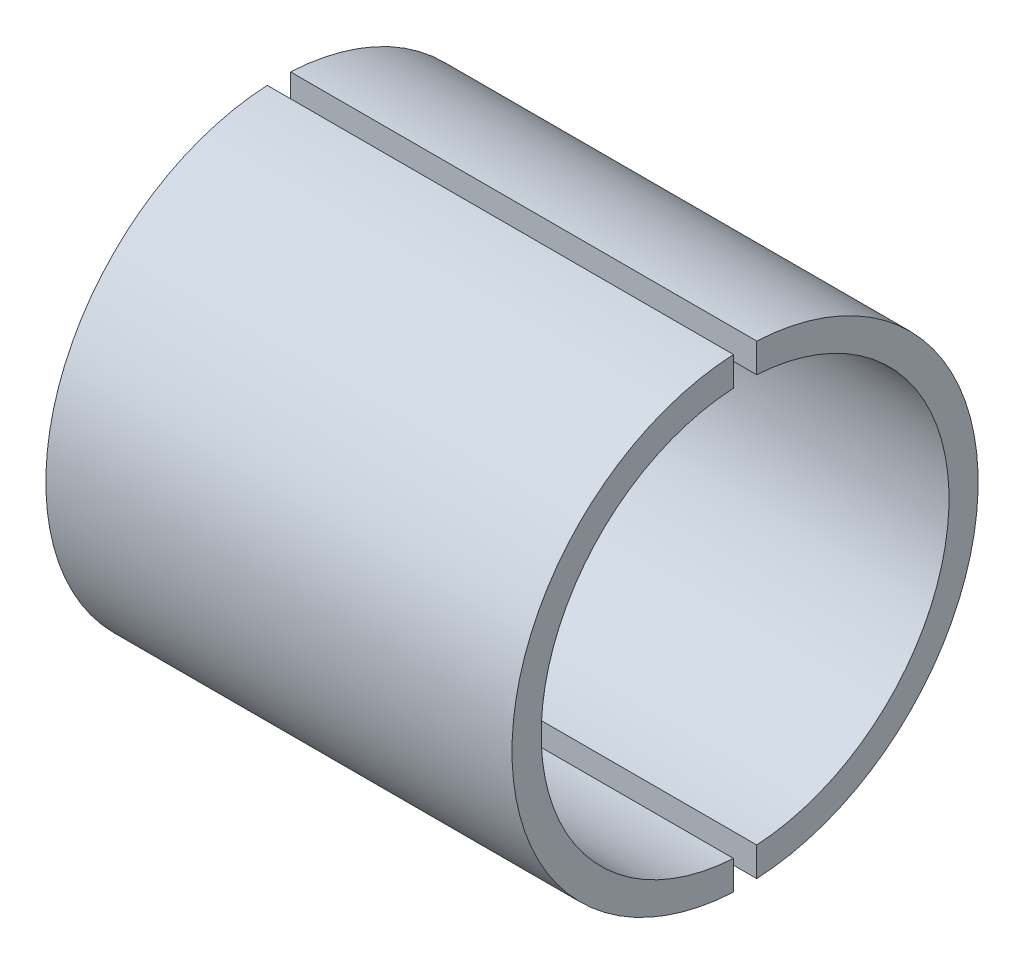
ISO-10303-21;
HEADER;
FILE_DESCRIPTION(('STEP AP214'),'2;1');
FILE_NAME('part.step','',(''),(''),'','','');
FILE_SCHEMA(('AUTOMOTIVE_DESIGN { 1 0 10303 214 1 1 1 1 }'));
ENDSEC;
DATA;
#1=APPLICATION_CONTEXT('core data for automotive mechanical design processes');
#2=APPLICATION_PROTOCOL_DEFINITION('international standard','automotive_design',2000,#1);
#3=PRODUCT_CONTEXT('',#1,'mechanical');
#4=PRODUCT('Part','Part','',(#3));
#5=PRODUCT_RELATED_PRODUCT_CATEGORY('part','',(#4));
#6=PRODUCT_DEFINITION_FORMATION('','',#4);
#7=PRODUCT_DEFINITION_CONTEXT('part definition',#1,'design');
#8=PRODUCT_DEFINITION('design','',#6,#7);
#9=PRODUCT_DEFINITION_SHAPE('','',#8);
#10=(LENGTH_UNIT() NAMED_UNIT(*) SI_UNIT(.MILLI.,.METRE.));
#11=(NAMED_UNIT(*) PLANE_ANGLE_UNIT() SI_UNIT($,.RADIAN.));
#12=(NAMED_UNIT(*) SI_UNIT($,.STERADIAN.) SOLID_ANGLE_UNIT());
#13=UNCERTAINTY_MEASURE_WITH_UNIT(LENGTH_MEASURE(1.E-05),#10,'distance_accuracy_value','');
#14=(GEOMETRIC_REPRESENTATION_CONTEXT(3) GLOBAL_UNCERTAINTY_ASSIGNED_CONTEXT((#13)) GLOBAL_UNIT_ASSIGNED_CONTEXT((#10,
#11,#12)) REPRESENTATION_CONTEXT('',''));
#15=CARTESIAN_POINT('',(0.,0.,0.));
#16=DIRECTION('',(0.,0.,1.));
#17=DIRECTION('',(1.,0.,0.));
#18=AXIS2_PLACEMENT_3D('',#15,#16,#17);
#19=CARTESIAN_POINT('',(40.,0.,0.));
#20=DIRECTION('',(-1.,0.,0.));
#21=DIRECTION('',(0.,0.,1.));
#22=AXIS2_PLACEMENT_3D('',#19,#20,#21);
#23=CYLINDRICAL_SURFACE('',#22,20.);
#24=CARTESIAN_POINT('',(40.,0.,0.));
#25=DIRECTION('',(1.,0.,0.));
#26=DIRECTION('',(0.,0.,-1.));
#27=AXIS2_PLACEMENT_3D('',#24,#25,#26);
#28=CIRCLE('',#27,20.);
#29=CARTESIAN_POINT('',(40.,19.9749843554382,1.));
#30=VERTEX_POINT('',#29);
#31=CARTESIAN_POINT('',(40.,-19.9749843554382,0.999999999999995));
#32=VERTEX_POINT('',#31);
#33=EDGE_CURVE('E107',#30,#32,#28,.T.);
#34=ORIENTED_EDGE('',*,*,#33,.F.);
#35=DIRECTION('',(-1.,0.,0.));
#36=VECTOR('',#35,1.);
#37=CARTESIAN_POINT('',(40.,19.9749843554382,1.));
#38=LINE('',#37,#36);
#39=CARTESIAN_POINT('',(0.,19.9749843554382,1.));
#40=VERTEX_POINT('',#39);
#41=EDGE_CURVE('E91',#30,#40,#38,.T.);
#42=ORIENTED_EDGE('',*,*,#41,.T.);
#43=CARTESIAN_POINT('',(0.,0.,0.));
#44=DIRECTION('',(1.,0.,0.));
#45=DIRECTION('',(0.,0.,-1.));
#46=AXIS2_PLACEMENT_3D('',#43,#44,#45);
#47=CIRCLE('',#46,20.);
#48=CARTESIAN_POINT('',(0.,-19.9749843554382,0.999999999999995));
#49=VERTEX_POINT('',#48);
#50=EDGE_CURVE('E101',#40,#49,#47,.T.);
#51=ORIENTED_EDGE('',*,*,#50,.T.);
#52=DIRECTION('',(-1.,0.,0.));
#53=VECTOR('',#52,1.);
#54=CARTESIAN_POINT('',(40.,-19.9749843554382,0.999999999999995));
#55=LINE('',#54,#53);
#56=EDGE_CURVE('E68',#49,#32,#55,.F.);
#57=ORIENTED_EDGE('',*,*,#56,.T.);
#58=EDGE_LOOP('',(#34,#42,#51,#57));
#59=FACE_BOUND('',#58,.T.);
#60=ADVANCED_FACE('F51',(#59),#23,.T.);
#61=CARTESIAN_POINT('',(40.,0.,0.));
#62=DIRECTION('',(1.,0.,0.));
#63=DIRECTION('',(0.,0.,-1.));
#64=AXIS2_PLACEMENT_3D('',#61,#62,#63);
#65=PLANE('',#64);
#66=DIRECTION('',(0.,-1.,0.));
#67=VECTOR('',#66,1.);
#68=CARTESIAN_POINT('',(40.,21.4786552684882,1.));
#69=LINE('',#68,#67);
#70=CARTESIAN_POINT('',(40.,17.4714052096562,1.));
#71=VERTEX_POINT('',#70);
#72=EDGE_CURVE('E60',#30,#71,#69,.T.);
#73=ORIENTED_EDGE('',*,*,#72,.F.);
#74=ORIENTED_EDGE('',*,*,#33,.T.);
#75=CARTESIAN_POINT('',(40.,-17.4714052096562,0.999999999999995));
#76=VERTEX_POINT('',#75);
#77=EDGE_CURVE('E12',#76,#32,#69,.T.);
#78=ORIENTED_EDGE('',*,*,#77,.F.);
#79=CARTESIAN_POINT('',(40.,0.,0.));
#80=DIRECTION('',(1.,0.,0.));
#81=DIRECTION('',(0.,0.,-1.));
#82=AXIS2_PLACEMENT_3D('',#79,#80,#81);
#83=CIRCLE('',#82,17.5);
#84=EDGE_CURVE('E54',#71,#76,#83,.T.);
#85=ORIENTED_EDGE('',*,*,#84,.F.);
#86=EDGE_LOOP('',(#73,#74,#78,#85));
#87=FACE_BOUND('',#86,.T.);
#88=ADVANCED_FACE('F106',(#87),#65,.T.);
#89=CARTESIAN_POINT('',(0.,0.,0.));
#90=DIRECTION('',(1.,0.,0.));
#91=DIRECTION('',(0.,0.,-1.));
#92=AXIS2_PLACEMENT_3D('',#89,#90,#91);
#93=PLANE('',#92);
#94=ORIENTED_EDGE('',*,*,#50,.F.);
#95=DIRECTION('',(0.,-1.,0.));
#96=VECTOR('',#95,1.);
#97=CARTESIAN_POINT('',(0.,21.4786552684882,1.));
#98=LINE('',#97,#96);
#99=CARTESIAN_POINT('',(0.,17.4714052096562,1.));
#100=VERTEX_POINT('',#99);
#101=EDGE_CURVE('E96',#40,#100,#98,.T.);
#102=ORIENTED_EDGE('',*,*,#101,.T.);
#103=CARTESIAN_POINT('',(0.,0.,0.));
#104=DIRECTION('',(1.,0.,0.));
#105=DIRECTION('',(0.,0.,-1.));
#106=AXIS2_PLACEMENT_3D('',#103,#104,#105);
#107=CIRCLE('',#106,17.5);
#108=CARTESIAN_POINT('',(0.,-17.4714052096562,0.999999999999995));
#109=VERTEX_POINT('',#108);
#110=EDGE_CURVE('E111',#100,#109,#107,.T.);
#111=ORIENTED_EDGE('',*,*,#110,.T.);
#112=EDGE_CURVE('E86',#109,#49,#98,.T.);
#113=ORIENTED_EDGE('',*,*,#112,.T.);
#114=EDGE_LOOP('',(#94,#102,#111,#113));
#115=FACE_BOUND('',#114,.T.);
#116=ADVANCED_FACE('F122',(#115),#93,.F.);
#117=CARTESIAN_POINT('',(0.,0.,0.));
#118=DIRECTION('',(1.,0.,0.));
#119=DIRECTION('',(0.,0.,-1.));
#120=AXIS2_PLACEMENT_3D('',#117,#118,#119);
#121=CYLINDRICAL_SURFACE('',#120,17.5);
#122=ORIENTED_EDGE('',*,*,#84,.T.);
#123=DIRECTION('',(1.,0.,0.));
#124=VECTOR('',#123,1.);
#125=CARTESIAN_POINT('',(0.,-17.4714052096562,0.999999999999995));
#126=LINE('',#125,#124);
#127=EDGE_CURVE('E84',#76,#109,#126,.F.);
#128=ORIENTED_EDGE('',*,*,#127,.T.);
#129=ORIENTED_EDGE('',*,*,#110,.F.);
#130=DIRECTION('',(1.,0.,0.));
#131=VECTOR('',#130,1.);
#132=CARTESIAN_POINT('',(0.,17.4714052096562,1.));
#133=LINE('',#132,#131);
#134=EDGE_CURVE('E109',#100,#71,#133,.T.);
#135=ORIENTED_EDGE('',*,*,#134,.T.);
#136=EDGE_LOOP('',(#122,#128,#129,#135));
#137=FACE_BOUND('',#136,.T.);
#138=ADVANCED_FACE('F121',(#137),#121,.F.);
#139=CARTESIAN_POINT('',(0.,21.4786552684882,1.));
#140=DIRECTION('',(0.,0.,1.));
#141=DIRECTION('',(0.,-1.,0.));
#142=AXIS2_PLACEMENT_3D('',#139,#140,#141);
#143=PLANE('',#142);
#144=ORIENTED_EDGE('',*,*,#72,.T.);
#145=ORIENTED_EDGE('',*,*,#134,.F.);
#146=ORIENTED_EDGE('',*,*,#101,.F.);
#147=ORIENTED_EDGE('',*,*,#41,.F.);
#148=EDGE_LOOP('',(#144,#145,#146,#147));
#149=FACE_BOUND('',#148,.T.);
#150=ADVANCED_FACE('F93',(#149),#143,.F.);
#151=ORIENTED_EDGE('',*,*,#112,.F.);
#152=ORIENTED_EDGE('',*,*,#127,.F.);
#153=ORIENTED_EDGE('',*,*,#77,.T.);
#154=ORIENTED_EDGE('',*,*,#56,.F.);
#155=EDGE_LOOP('',(#151,#152,#153,#154));
#156=FACE_BOUND('',#155,.T.);
#157=ADVANCED_FACE('F156',(#156),#143,.F.);
#158=CLOSED_SHELL('',(#60,#88,#116,#138,#150,#157));
#159=MANIFOLD_SOLID_BREP('B2',#158);
#160=CARTESIAN_POINT('',(0.,0.,0.));
#161=DIRECTION('',(1.,0.,0.));
#162=DIRECTION('',(0.,0.,-1.));
#163=AXIS2_PLACEMENT_3D('',#160,#161,#162);
#164=CYLINDRICAL_SURFACE('',#163,17.5);
#165=CARTESIAN_POINT('',(40.,0.,0.));
#166=DIRECTION('',(1.,0.,0.));
#167=DIRECTION('',(0.,0.,-1.));
#168=AXIS2_PLACEMENT_3D('',#165,#166,#167);
#169=CIRCLE('',#168,17.5);
#170=CARTESIAN_POINT('',(40.,-17.4714052096562,-1.));
#171=VERTEX_POINT('',#170);
#172=CARTESIAN_POINT('',(40.,17.4714052096562,-1.));
#173=VERTEX_POINT('',#172);
#174=EDGE_CURVE('E220',#171,#173,#169,.T.);
#175=ORIENTED_EDGE('',*,*,#174,.T.);
#176=DIRECTION('',(1.,0.,0.));
#177=VECTOR('',#176,1.);
#178=CARTESIAN_POINT('',(0.,17.4714052096562,-1.));
#179=LINE('',#178,#177);
#180=CARTESIAN_POINT('',(0.,17.4714052096562,-1.));
#181=VERTEX_POINT('',#180);
#182=EDGE_CURVE('E49',#173,#181,#179,.F.);
#183=ORIENTED_EDGE('',*,*,#182,.T.);
#184=CARTESIAN_POINT('',(0.,0.,0.));
#185=DIRECTION('',(1.,0.,0.));
#186=DIRECTION('',(0.,0.,-1.));
#187=AXIS2_PLACEMENT_3D('',#184,#185,#186);
#188=CIRCLE('',#187,17.5);
#189=CARTESIAN_POINT('',(0.,-17.4714052096562,-1.));
#190=VERTEX_POINT('',#189);
#191=EDGE_CURVE('E235',#190,#181,#188,.T.);
#192=ORIENTED_EDGE('',*,*,#191,.F.);
#193=DIRECTION('',(1.,0.,0.));
#194=VECTOR('',#193,1.);
#195=CARTESIAN_POINT('',(0.,-17.4714052096562,-1.));
#196=LINE('',#195,#194);
#197=EDGE_CURVE('E182',#190,#171,#196,.T.);
#198=ORIENTED_EDGE('',*,*,#197,.T.);
#199=EDGE_LOOP('',(#175,#183,#192,#198));
#200=FACE_BOUND('',#199,.T.);
#201=ADVANCED_FACE('F174',(#200),#164,.F.);
#202=CARTESIAN_POINT('',(0.,0.,0.));
#203=DIRECTION('',(1.,0.,0.));
#204=DIRECTION('',(0.,0.,-1.));
#205=AXIS2_PLACEMENT_3D('',#202,#203,#204);
#206=PLANE('',#205);
#207=CARTESIAN_POINT('',(0.,0.,0.));
#208=DIRECTION('',(1.,0.,0.));
#209=DIRECTION('',(0.,0.,-1.));
#210=AXIS2_PLACEMENT_3D('',#207,#208,#209);
#211=CIRCLE('',#210,20.);
#212=CARTESIAN_POINT('',(0.,-19.9749843554382,-1.));
#213=VERTEX_POINT('',#212);
#214=CARTESIAN_POINT('',(0.,19.9749843554382,-1.));
#215=VERTEX_POINT('',#214);
#216=EDGE_CURVE('E233',#213,#215,#211,.T.);
#217=ORIENTED_EDGE('',*,*,#216,.F.);
#218=DIRECTION('',(0.,1.,0.));
#219=VECTOR('',#218,1.);
#220=CARTESIAN_POINT('',(0.,21.4786552684882,-1.));
#221=LINE('',#220,#219);
#222=EDGE_CURVE('E215',#213,#190,#221,.T.);
#223=ORIENTED_EDGE('',*,*,#222,.T.);
#224=ORIENTED_EDGE('',*,*,#191,.T.);
#225=EDGE_CURVE('E197',#181,#215,#221,.T.);
#226=ORIENTED_EDGE('',*,*,#225,.T.);
#227=EDGE_LOOP('',(#217,#223,#224,#226));
#228=FACE_BOUND('',#227,.T.);
#229=ADVANCED_FACE('F244',(#228),#206,.F.);
#230=CARTESIAN_POINT('',(40.,0.,0.));
#231=DIRECTION('',(1.,0.,0.));
#232=DIRECTION('',(0.,0.,-1.));
#233=AXIS2_PLACEMENT_3D('',#230,#231,#232);
#234=PLANE('',#233);
#235=DIRECTION('',(0.,1.,0.));
#236=VECTOR('',#235,1.);
#237=CARTESIAN_POINT('',(40.,21.4786552684882,-1.));
#238=LINE('',#237,#236);
#239=CARTESIAN_POINT('',(40.,-19.9749843554382,-1.));
#240=VERTEX_POINT('',#239);
#241=EDGE_CURVE('E189',#240,#171,#238,.T.);
#242=ORIENTED_EDGE('',*,*,#241,.F.);
#243=CARTESIAN_POINT('',(40.,0.,0.));
#244=DIRECTION('',(1.,0.,0.));
#245=DIRECTION('',(0.,0.,-1.));
#246=AXIS2_PLACEMENT_3D('',#243,#244,#245);
#247=CIRCLE('',#246,20.);
#248=CARTESIAN_POINT('',(40.,19.9749843554382,-1.));
#249=VERTEX_POINT('',#248);
#250=EDGE_CURVE('E228',#240,#249,#247,.T.);
#251=ORIENTED_EDGE('',*,*,#250,.T.);
#252=EDGE_CURVE('E230',#173,#249,#238,.T.);
#253=ORIENTED_EDGE('',*,*,#252,.F.);
#254=ORIENTED_EDGE('',*,*,#174,.F.);
#255=EDGE_LOOP('',(#242,#251,#253,#254));
#256=FACE_BOUND('',#255,.T.);
#257=ADVANCED_FACE('F226',(#256),#234,.T.);
#258=CARTESIAN_POINT('',(40.,0.,0.));
#259=DIRECTION('',(-1.,0.,0.));
#260=DIRECTION('',(0.,0.,1.));
#261=AXIS2_PLACEMENT_3D('',#258,#259,#260);
#262=CYLINDRICAL_SURFACE('',#261,20.);
#263=ORIENTED_EDGE('',*,*,#250,.F.);
#264=DIRECTION('',(-1.,0.,0.));
#265=VECTOR('',#264,1.);
#266=CARTESIAN_POINT('',(40.,-19.9749843554382,-1.));
#267=LINE('',#266,#265);
#268=EDGE_CURVE('E212',#240,#213,#267,.T.);
#269=ORIENTED_EDGE('',*,*,#268,.T.);
#270=ORIENTED_EDGE('',*,*,#216,.T.);
#271=DIRECTION('',(-1.,0.,0.));
#272=VECTOR('',#271,1.);
#273=CARTESIAN_POINT('',(40.,19.9749843554382,-1.));
#274=LINE('',#273,#272);
#275=EDGE_CURVE('E221',#215,#249,#274,.F.);
#276=ORIENTED_EDGE('',*,*,#275,.T.);
#277=EDGE_LOOP('',(#263,#269,#270,#276));
#278=FACE_BOUND('',#277,.T.);
#279=ADVANCED_FACE('F176',(#278),#262,.T.);
#280=CARTESIAN_POINT('',(0.,21.4786552684882,-1.));
#281=DIRECTION('',(0.,0.,-1.));
#282=DIRECTION('',(0.,1.,0.));
#283=AXIS2_PLACEMENT_3D('',#280,#281,#282);
#284=PLANE('',#283);
#285=ORIENTED_EDGE('',*,*,#241,.T.);
#286=ORIENTED_EDGE('',*,*,#197,.F.);
#287=ORIENTED_EDGE('',*,*,#222,.F.);
#288=ORIENTED_EDGE('',*,*,#268,.F.);
#289=EDGE_LOOP('',(#285,#286,#287,#288));
#290=FACE_BOUND('',#289,.T.);
#291=ADVANCED_FACE('F213',(#290),#284,.F.);
#292=ORIENTED_EDGE('',*,*,#225,.F.);
#293=ORIENTED_EDGE('',*,*,#182,.F.);
#294=ORIENTED_EDGE('',*,*,#252,.T.);
#295=ORIENTED_EDGE('',*,*,#275,.F.);
#296=EDGE_LOOP('',(#292,#293,#294,#295));
#297=FACE_BOUND('',#296,.T.);
#298=ADVANCED_FACE('F246',(#297),#284,.F.);
#299=CLOSED_SHELL('',(#201,#229,#257,#279,#291,#298));
#300=MANIFOLD_SOLID_BREP('B6',#299);
#301=ADVANCED_BREP_SHAPE_REPRESENTATION('',(#18,#159,#300),#14);
#302=SHAPE_DEFINITION_REPRESENTATION(#9,#301);
ENDSEC;
END-ISO-10303-21;
